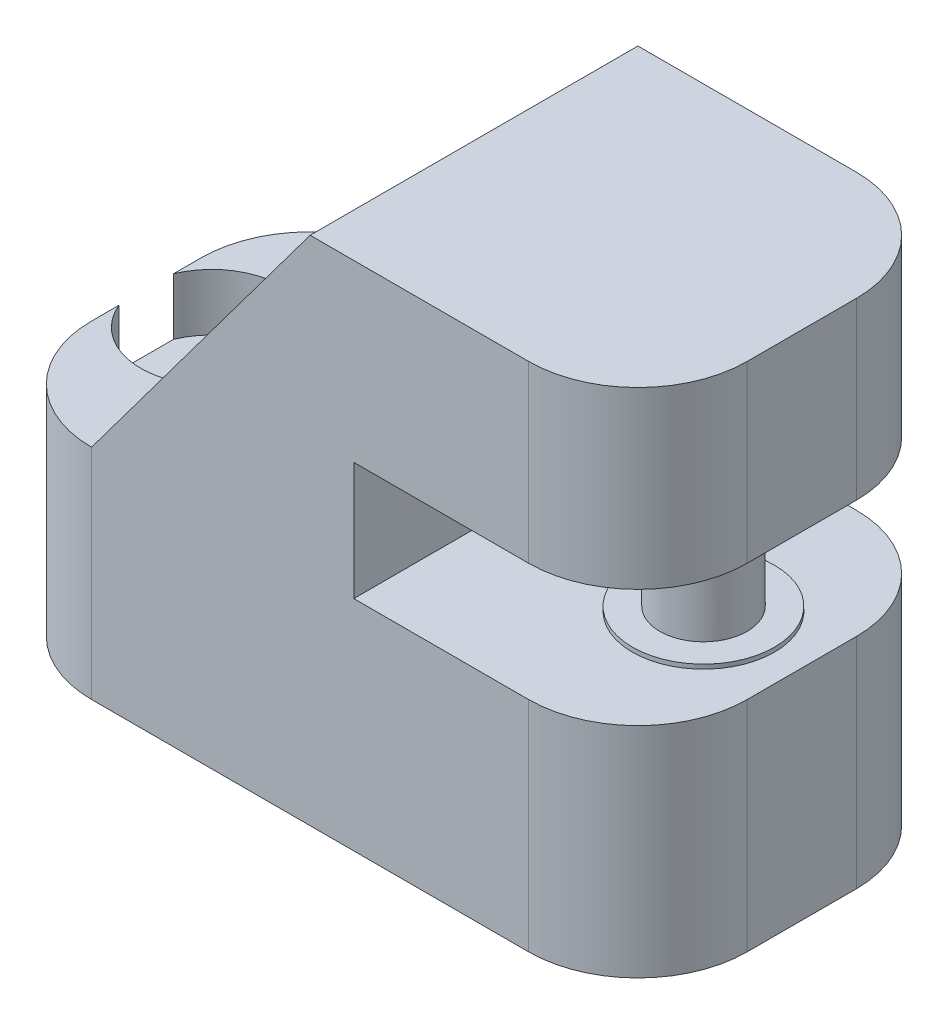
ISO-10303-21;
HEADER;
FILE_DESCRIPTION(('STEP AP214'),'2;1');
FILE_NAME('part.step','',(''),(''),'','','');
FILE_SCHEMA(('AUTOMOTIVE_DESIGN { 1 0 10303 214 1 1 1 1 }'));
ENDSEC;
DATA;
#1=APPLICATION_CONTEXT('core data for automotive mechanical design processes');
#2=APPLICATION_PROTOCOL_DEFINITION('international standard','automotive_design',2000,#1);
#3=PRODUCT_CONTEXT('',#1,'mechanical');
#4=PRODUCT('Part','Part','',(#3));
#5=PRODUCT_RELATED_PRODUCT_CATEGORY('part','',(#4));
#6=PRODUCT_DEFINITION_FORMATION('','',#4);
#7=PRODUCT_DEFINITION_CONTEXT('part definition',#1,'design');
#8=PRODUCT_DEFINITION('design','',#6,#7);
#9=PRODUCT_DEFINITION_SHAPE('','',#8);
#10=(LENGTH_UNIT() NAMED_UNIT(*) SI_UNIT(.MILLI.,.METRE.));
#11=(NAMED_UNIT(*) PLANE_ANGLE_UNIT() SI_UNIT($,.RADIAN.));
#12=(NAMED_UNIT(*) SI_UNIT($,.STERADIAN.) SOLID_ANGLE_UNIT());
#13=UNCERTAINTY_MEASURE_WITH_UNIT(LENGTH_MEASURE(1.E-05),#10,'distance_accuracy_value','');
#14=(GEOMETRIC_REPRESENTATION_CONTEXT(3) GLOBAL_UNCERTAINTY_ASSIGNED_CONTEXT((#13)) GLOBAL_UNIT_ASSIGNED_CONTEXT((#10,
#11,#12)) REPRESENTATION_CONTEXT('',''));
#15=CARTESIAN_POINT('',(0.,0.,0.));
#16=DIRECTION('',(0.,0.,1.));
#17=DIRECTION('',(1.,0.,0.));
#18=AXIS2_PLACEMENT_3D('',#15,#16,#17);
#19=CARTESIAN_POINT('',(0.,10.,-15.));
#20=DIRECTION('',(0.,-1.,0.));
#21=DIRECTION('',(0.,0.,1.));
#22=AXIS2_PLACEMENT_3D('',#19,#20,#21);
#23=PLANE('',#22);
#24=DIRECTION('',(0.,0.,1.));
#25=VECTOR('',#24,1.);
#26=CARTESIAN_POINT('',(5.,10.,-15.));
#27=LINE('',#26,#25);
#28=CARTESIAN_POINT('',(5.,10.,-15.));
#29=VERTEX_POINT('',#28);
#30=CARTESIAN_POINT('',(5.,10.,-10.0617376914899));
#31=VERTEX_POINT('',#30);
#32=EDGE_CURVE('E322',#29,#31,#27,.T.);
#33=ORIENTED_EDGE('',*,*,#32,.F.);
#34=CARTESIAN_POINT('',(5.,10.,-10.));
#35=DIRECTION('',(0.,1.,0.));
#36=DIRECTION('',(0.,0.,1.));
#37=AXIS2_PLACEMENT_3D('',#34,#35,#36);
#38=CIRCLE('',#37,5.);
#39=CARTESIAN_POINT('',(0.,10.,-10.));
#40=VERTEX_POINT('',#39);
#41=EDGE_CURVE('E244',#40,#29,#38,.F.);
#42=ORIENTED_EDGE('',*,*,#41,.F.);
#43=DIRECTION('',(0.,0.,1.));
#44=VECTOR('',#43,1.);
#45=CARTESIAN_POINT('',(0.,10.,-15.));
#46=LINE('',#45,#44);
#47=CARTESIAN_POINT('',(0.,10.,-8.74999999999999));
#48=VERTEX_POINT('',#47);
#49=EDGE_CURVE('E327',#40,#48,#46,.T.);
#50=ORIENTED_EDGE('',*,*,#49,.T.);
#51=CARTESIAN_POINT('',(3.,10.,-7.5));
#52=DIRECTION('',(0.,1.,0.));
#53=DIRECTION('',(0.,0.,1.));
#54=AXIS2_PLACEMENT_3D('',#51,#52,#53);
#55=CIRCLE('',#54,3.25);
#56=EDGE_CURVE('E405',#31,#48,#55,.T.);
#57=ORIENTED_EDGE('',*,*,#56,.F.);
#58=EDGE_LOOP('',(#33,#42,#50,#57));
#59=FACE_BOUND('',#58,.T.);
#60=ADVANCED_FACE('F47',(#59),#23,.F.);
#61=CARTESIAN_POINT('',(30.,0.,-15.));
#62=DIRECTION('',(0.,1.,0.));
#63=DIRECTION('',(-1.,0.,0.));
#64=AXIS2_PLACEMENT_3D('',#61,#62,#63);
#65=PLANE('',#64);
#66=CARTESIAN_POINT('',(3.,0.,-7.5));
#67=DIRECTION('',(0.,-1.,0.));
#68=DIRECTION('',(0.,0.,-1.));
#69=AXIS2_PLACEMENT_3D('',#66,#67,#68);
#70=CIRCLE('',#69,1.69999999999999);
#71=CARTESIAN_POINT('',(3.,0.,-9.19999999999999));
#72=VERTEX_POINT('',#71);
#73=EDGE_CURVE('E408',#72,#72,#70,.T.);
#74=ORIENTED_EDGE('',*,*,#73,.F.);
#75=EDGE_LOOP('',(#74));
#76=FACE_BOUND('',#75,.T.);
#77=CARTESIAN_POINT('',(10.,0.,-7.5));
#78=DIRECTION('',(0.,-1.,0.));
#79=DIRECTION('',(0.,0.,-1.));
#80=AXIS2_PLACEMENT_3D('',#77,#78,#79);
#81=CIRCLE('',#80,1.69999999999999);
#82=CARTESIAN_POINT('',(10.,0.,-9.19999999999999));
#83=VERTEX_POINT('',#82);
#84=EDGE_CURVE('E198',#83,#83,#81,.T.);
#85=ORIENTED_EDGE('',*,*,#84,.F.);
#86=EDGE_LOOP('',(#85));
#87=FACE_BOUND('',#86,.T.);
#88=DIRECTION('',(0.,0.,1.));
#89=VECTOR('',#88,1.);
#90=CARTESIAN_POINT('',(0.,0.,-15.));
#91=LINE('',#90,#89);
#92=CARTESIAN_POINT('',(0.,0.,-10.));
#93=VERTEX_POINT('',#92);
#94=CARTESIAN_POINT('',(0.,0.,-5.));
#95=VERTEX_POINT('',#94);
#96=EDGE_CURVE('E331',#93,#95,#91,.T.);
#97=ORIENTED_EDGE('',*,*,#96,.F.);
#98=CARTESIAN_POINT('',(5.,0.,-10.));
#99=DIRECTION('',(0.,-1.,0.));
#100=DIRECTION('',(-1.,0.,0.));
#101=AXIS2_PLACEMENT_3D('',#98,#99,#100);
#102=CIRCLE('',#101,5.);
#103=CARTESIAN_POINT('',(5.,0.,-15.));
#104=VERTEX_POINT('',#103);
#105=EDGE_CURVE('E261',#104,#93,#102,.F.);
#106=ORIENTED_EDGE('',*,*,#105,.F.);
#107=DIRECTION('',(1.,0.,0.));
#108=VECTOR('',#107,1.);
#109=CARTESIAN_POINT('',(30.,0.,-15.));
#110=LINE('',#109,#108);
#111=CARTESIAN_POINT('',(25.,0.,-15.));
#112=VERTEX_POINT('',#111);
#113=EDGE_CURVE('E340',#104,#112,#110,.T.);
#114=ORIENTED_EDGE('',*,*,#113,.T.);
#115=CARTESIAN_POINT('',(25.,0.,-10.));
#116=DIRECTION('',(0.,-1.,0.));
#117=DIRECTION('',(-1.,0.,0.));
#118=AXIS2_PLACEMENT_3D('',#115,#116,#117);
#119=CIRCLE('',#118,5.);
#120=CARTESIAN_POINT('',(30.,0.,-10.));
#121=VERTEX_POINT('',#120);
#122=EDGE_CURVE('E269',#121,#112,#119,.F.);
#123=ORIENTED_EDGE('',*,*,#122,.F.);
#124=DIRECTION('',(0.,0.,1.));
#125=VECTOR('',#124,1.);
#126=CARTESIAN_POINT('',(30.,0.,-15.));
#127=LINE('',#126,#125);
#128=CARTESIAN_POINT('',(30.,0.,-5.));
#129=VERTEX_POINT('',#128);
#130=EDGE_CURVE('E289',#121,#129,#127,.T.);
#131=ORIENTED_EDGE('',*,*,#130,.T.);
#132=CARTESIAN_POINT('',(25.,0.,-5.));
#133=DIRECTION('',(0.,-1.,0.));
#134=DIRECTION('',(-1.,0.,0.));
#135=AXIS2_PLACEMENT_3D('',#132,#133,#134);
#136=CIRCLE('',#135,5.);
#137=CARTESIAN_POINT('',(25.,0.,0.));
#138=VERTEX_POINT('',#137);
#139=EDGE_CURVE('E265',#138,#129,#136,.F.);
#140=ORIENTED_EDGE('',*,*,#139,.F.);
#141=DIRECTION('',(1.,0.,0.));
#142=VECTOR('',#141,1.);
#143=CARTESIAN_POINT('',(30.,0.,0.));
#144=LINE('',#143,#142);
#145=CARTESIAN_POINT('',(5.,0.,0.));
#146=VERTEX_POINT('',#145);
#147=EDGE_CURVE('E294',#146,#138,#144,.T.);
#148=ORIENTED_EDGE('',*,*,#147,.F.);
#149=CARTESIAN_POINT('',(5.,0.,-5.));
#150=DIRECTION('',(0.,-1.,0.));
#151=DIRECTION('',(-1.,0.,0.));
#152=AXIS2_PLACEMENT_3D('',#149,#150,#151);
#153=CIRCLE('',#152,5.);
#154=EDGE_CURVE('E257',#95,#146,#153,.F.);
#155=ORIENTED_EDGE('',*,*,#154,.F.);
#156=EDGE_LOOP('',(#97,#106,#114,#123,#131,#140,#148,#155));
#157=FACE_BOUND('',#156,.T.);
#158=ADVANCED_FACE('F428',(#76,#87,#157),#65,.F.);
#159=CARTESIAN_POINT('',(30.,10.,-15.));
#160=DIRECTION('',(-1.,0.,0.));
#161=DIRECTION('',(0.,0.,-1.));
#162=AXIS2_PLACEMENT_3D('',#159,#160,#161);
#163=PLANE('',#162);
#164=ORIENTED_EDGE('',*,*,#130,.F.);
#165=DIRECTION('',(0.,1.,0.));
#166=VECTOR('',#165,1.);
#167=CARTESIAN_POINT('',(30.,10.,-10.));
#168=LINE('',#167,#166);
#169=CARTESIAN_POINT('',(30.,10.,-10.));
#170=VERTEX_POINT('',#169);
#171=EDGE_CURVE('E206',#170,#121,#168,.F.);
#172=ORIENTED_EDGE('',*,*,#171,.F.);
#173=DIRECTION('',(0.,0.,1.));
#174=VECTOR('',#173,1.);
#175=CARTESIAN_POINT('',(30.,10.,-15.));
#176=LINE('',#175,#174);
#177=CARTESIAN_POINT('',(30.,10.,-5.));
#178=VERTEX_POINT('',#177);
#179=EDGE_CURVE('E298',#170,#178,#176,.T.);
#180=ORIENTED_EDGE('',*,*,#179,.T.);
#181=DIRECTION('',(0.,1.,0.));
#182=VECTOR('',#181,1.);
#183=CARTESIAN_POINT('',(30.,10.,-5.));
#184=LINE('',#183,#182);
#185=EDGE_CURVE('E204',#129,#178,#184,.T.);
#186=ORIENTED_EDGE('',*,*,#185,.F.);
#187=EDGE_LOOP('',(#164,#172,#180,#186));
#188=FACE_BOUND('',#187,.T.);
#189=ADVANCED_FACE('F435',(#188),#163,.F.);
#190=CARTESIAN_POINT('',(17.,10.,-15.));
#191=DIRECTION('',(0.,-1.,0.));
#192=DIRECTION('',(1.,0.,0.));
#193=AXIS2_PLACEMENT_3D('',#190,#191,#192);
#194=PLANE('',#193);
#195=CARTESIAN_POINT('',(25.5,10.,-7.5));
#196=DIRECTION('',(0.,1.,0.));
#197=DIRECTION('',(1.,0.,0.));
#198=AXIS2_PLACEMENT_3D('',#195,#196,#197);
#199=CIRCLE('',#198,3.25);
#200=CARTESIAN_POINT('',(28.75,10.,-7.5));
#201=VERTEX_POINT('',#200);
#202=EDGE_CURVE('E279',#201,#201,#199,.F.);
#203=ORIENTED_EDGE('',*,*,#202,.T.);
#204=EDGE_LOOP('',(#203));
#205=FACE_BOUND('',#204,.T.);
#206=ORIENTED_EDGE('',*,*,#179,.F.);
#207=CARTESIAN_POINT('',(25.,10.,-10.));
#208=DIRECTION('',(0.,1.,0.));
#209=DIRECTION('',(1.,0.,0.));
#210=AXIS2_PLACEMENT_3D('',#207,#208,#209);
#211=CIRCLE('',#210,5.);
#212=CARTESIAN_POINT('',(25.,10.,-15.));
#213=VERTEX_POINT('',#212);
#214=EDGE_CURVE('E201',#213,#170,#211,.F.);
#215=ORIENTED_EDGE('',*,*,#214,.F.);
#216=DIRECTION('',(-1.,0.,0.));
#217=VECTOR('',#216,1.);
#218=CARTESIAN_POINT('',(17.,10.,-15.));
#219=LINE('',#218,#217);
#220=CARTESIAN_POINT('',(17.,10.,-15.));
#221=VERTEX_POINT('',#220);
#222=EDGE_CURVE('E374',#213,#221,#219,.T.);
#223=ORIENTED_EDGE('',*,*,#222,.T.);
#224=DIRECTION('',(0.,0.,1.));
#225=VECTOR('',#224,1.);
#226=CARTESIAN_POINT('',(17.,10.,-15.));
#227=LINE('',#226,#225);
#228=CARTESIAN_POINT('',(17.,10.,0.));
#229=VERTEX_POINT('',#228);
#230=EDGE_CURVE('E302',#221,#229,#227,.T.);
#231=ORIENTED_EDGE('',*,*,#230,.T.);
#232=DIRECTION('',(-1.,0.,0.));
#233=VECTOR('',#232,1.);
#234=CARTESIAN_POINT('',(17.,10.,0.));
#235=LINE('',#234,#233);
#236=CARTESIAN_POINT('',(25.,10.,0.));
#237=VERTEX_POINT('',#236);
#238=EDGE_CURVE('E353',#237,#229,#235,.T.);
#239=ORIENTED_EDGE('',*,*,#238,.F.);
#240=CARTESIAN_POINT('',(25.,10.,-5.));
#241=DIRECTION('',(0.,1.,0.));
#242=DIRECTION('',(1.,0.,0.));
#243=AXIS2_PLACEMENT_3D('',#240,#241,#242);
#244=CIRCLE('',#243,5.);
#245=EDGE_CURVE('E70',#178,#237,#244,.F.);
#246=ORIENTED_EDGE('',*,*,#245,.F.);
#247=EDGE_LOOP('',(#206,#215,#223,#231,#239,#246));
#248=FACE_BOUND('',#247,.T.);
#249=ADVANCED_FACE('F492',(#205,#248),#194,.F.);
#250=CARTESIAN_POINT('',(17.,15.4,-15.));
#251=DIRECTION('',(-1.,0.,0.));
#252=DIRECTION('',(0.,0.,-1.));
#253=AXIS2_PLACEMENT_3D('',#250,#251,#252);
#254=PLANE('',#253);
#255=DIRECTION('',(0.,1.,0.));
#256=VECTOR('',#255,1.);
#257=CARTESIAN_POINT('',(17.,15.4,0.));
#258=LINE('',#257,#256);
#259=CARTESIAN_POINT('',(17.,15.4,0.));
#260=VERTEX_POINT('',#259);
#261=EDGE_CURVE('E349',#229,#260,#258,.T.);
#262=ORIENTED_EDGE('',*,*,#261,.F.);
#263=ORIENTED_EDGE('',*,*,#230,.F.);
#264=DIRECTION('',(0.,1.,0.));
#265=VECTOR('',#264,1.);
#266=CARTESIAN_POINT('',(17.,15.4,-15.));
#267=LINE('',#266,#265);
#268=CARTESIAN_POINT('',(17.,15.4,-15.));
#269=VERTEX_POINT('',#268);
#270=EDGE_CURVE('E370',#221,#269,#267,.T.);
#271=ORIENTED_EDGE('',*,*,#270,.T.);
#272=DIRECTION('',(0.,0.,1.));
#273=VECTOR('',#272,1.);
#274=CARTESIAN_POINT('',(17.,15.4,-15.));
#275=LINE('',#274,#273);
#276=EDGE_CURVE('E306',#269,#260,#275,.T.);
#277=ORIENTED_EDGE('',*,*,#276,.T.);
#278=EDGE_LOOP('',(#262,#263,#271,#277));
#279=FACE_BOUND('',#278,.T.);
#280=ADVANCED_FACE('F494',(#279),#254,.F.);
#281=CARTESIAN_POINT('',(30.,15.4,-15.));
#282=DIRECTION('',(0.,1.,0.));
#283=DIRECTION('',(-1.,0.,0.));
#284=AXIS2_PLACEMENT_3D('',#281,#282,#283);
#285=PLANE('',#284);
#286=CARTESIAN_POINT('',(25.5,15.4,-7.5));
#287=DIRECTION('',(0.,-1.,0.));
#288=DIRECTION('',(-1.,0.,0.));
#289=AXIS2_PLACEMENT_3D('',#286,#287,#288);
#290=CIRCLE('',#289,3.25);
#291=CARTESIAN_POINT('',(22.25,15.4,-7.5));
#292=VERTEX_POINT('',#291);
#293=EDGE_CURVE('E197',#292,#292,#290,.T.);
#294=ORIENTED_EDGE('',*,*,#293,.F.);
#295=EDGE_LOOP('',(#294));
#296=FACE_BOUND('',#295,.T.);
#297=DIRECTION('',(1.,0.,0.));
#298=VECTOR('',#297,1.);
#299=CARTESIAN_POINT('',(30.,15.4,0.));
#300=LINE('',#299,#298);
#301=CARTESIAN_POINT('',(25.,15.4,0.));
#302=VERTEX_POINT('',#301);
#303=EDGE_CURVE('E345',#260,#302,#300,.T.);
#304=ORIENTED_EDGE('',*,*,#303,.F.);
#305=ORIENTED_EDGE('',*,*,#276,.F.);
#306=DIRECTION('',(1.,0.,0.));
#307=VECTOR('',#306,1.);
#308=CARTESIAN_POINT('',(30.,15.4,-15.));
#309=LINE('',#308,#307);
#310=CARTESIAN_POINT('',(25.,15.4,-15.));
#311=VERTEX_POINT('',#310);
#312=EDGE_CURVE('E366',#269,#311,#309,.T.);
#313=ORIENTED_EDGE('',*,*,#312,.T.);
#314=CARTESIAN_POINT('',(25.,15.4,-10.));
#315=DIRECTION('',(0.,-1.,0.));
#316=DIRECTION('',(-1.,0.,0.));
#317=AXIS2_PLACEMENT_3D('',#314,#315,#316);
#318=CIRCLE('',#317,5.);
#319=CARTESIAN_POINT('',(30.,15.4,-10.));
#320=VERTEX_POINT('',#319);
#321=EDGE_CURVE('E213',#320,#311,#318,.F.);
#322=ORIENTED_EDGE('',*,*,#321,.F.);
#323=DIRECTION('',(0.,0.,1.));
#324=VECTOR('',#323,1.);
#325=CARTESIAN_POINT('',(30.,15.4,-15.));
#326=LINE('',#325,#324);
#327=CARTESIAN_POINT('',(30.,15.4,-5.));
#328=VERTEX_POINT('',#327);
#329=EDGE_CURVE('E310',#320,#328,#326,.T.);
#330=ORIENTED_EDGE('',*,*,#329,.T.);
#331=CARTESIAN_POINT('',(25.,15.4,-5.));
#332=DIRECTION('',(0.,-1.,0.));
#333=DIRECTION('',(-1.,0.,0.));
#334=AXIS2_PLACEMENT_3D('',#331,#332,#333);
#335=CIRCLE('',#334,5.);
#336=EDGE_CURVE('E209',#302,#328,#335,.F.);
#337=ORIENTED_EDGE('',*,*,#336,.F.);
#338=EDGE_LOOP('',(#304,#305,#313,#322,#330,#337));
#339=FACE_BOUND('',#338,.T.);
#340=ADVANCED_FACE('F497',(#296,#339),#285,.F.);
#341=CARTESIAN_POINT('',(30.,23.4,-15.));
#342=DIRECTION('',(-1.,0.,0.));
#343=DIRECTION('',(0.,-1.,0.));
#344=AXIS2_PLACEMENT_3D('',#341,#342,#343);
#345=PLANE('',#344);
#346=ORIENTED_EDGE('',*,*,#329,.F.);
#347=DIRECTION('',(0.,1.,0.));
#348=VECTOR('',#347,1.);
#349=CARTESIAN_POINT('',(30.,23.4,-10.));
#350=LINE('',#349,#348);
#351=CARTESIAN_POINT('',(30.,23.4,-10.));
#352=VERTEX_POINT('',#351);
#353=EDGE_CURVE('E228',#352,#320,#350,.F.);
#354=ORIENTED_EDGE('',*,*,#353,.F.);
#355=DIRECTION('',(0.,0.,1.));
#356=VECTOR('',#355,1.);
#357=CARTESIAN_POINT('',(30.,23.4,-15.));
#358=LINE('',#357,#356);
#359=CARTESIAN_POINT('',(30.,23.4,-5.));
#360=VERTEX_POINT('',#359);
#361=EDGE_CURVE('E314',#352,#360,#358,.T.);
#362=ORIENTED_EDGE('',*,*,#361,.T.);
#363=DIRECTION('',(0.,1.,0.));
#364=VECTOR('',#363,1.);
#365=CARTESIAN_POINT('',(30.,23.4,-5.));
#366=LINE('',#365,#364);
#367=EDGE_CURVE('E224',#328,#360,#366,.T.);
#368=ORIENTED_EDGE('',*,*,#367,.F.);
#369=EDGE_LOOP('',(#346,#354,#362,#368));
#370=FACE_BOUND('',#369,.T.);
#371=ADVANCED_FACE('F505',(#370),#345,.F.);
#372=CARTESIAN_POINT('',(15.,23.4,-15.));
#373=DIRECTION('',(0.,-1.,0.));
#374=DIRECTION('',(0.,0.,1.));
#375=AXIS2_PLACEMENT_3D('',#372,#373,#374);
#376=PLANE('',#375);
#377=ORIENTED_EDGE('',*,*,#361,.F.);
#378=CARTESIAN_POINT('',(25.,23.4,-10.));
#379=DIRECTION('',(0.,1.,0.));
#380=DIRECTION('',(0.,0.,1.));
#381=AXIS2_PLACEMENT_3D('',#378,#379,#380);
#382=CIRCLE('',#381,5.);
#383=CARTESIAN_POINT('',(25.,23.4,-15.));
#384=VERTEX_POINT('',#383);
#385=EDGE_CURVE('E221',#384,#352,#382,.F.);
#386=ORIENTED_EDGE('',*,*,#385,.F.);
#387=DIRECTION('',(-1.,0.,0.));
#388=VECTOR('',#387,1.);
#389=CARTESIAN_POINT('',(15.,23.4,-15.));
#390=LINE('',#389,#388);
#391=CARTESIAN_POINT('',(15.,23.4,-15.));
#392=VERTEX_POINT('',#391);
#393=EDGE_CURVE('E362',#384,#392,#390,.T.);
#394=ORIENTED_EDGE('',*,*,#393,.T.);
#395=DIRECTION('',(0.,0.,1.));
#396=VECTOR('',#395,1.);
#397=CARTESIAN_POINT('',(15.,23.4,-15.));
#398=LINE('',#397,#396);
#399=CARTESIAN_POINT('',(15.,23.4,0.));
#400=VERTEX_POINT('',#399);
#401=EDGE_CURVE('E318',#392,#400,#398,.T.);
#402=ORIENTED_EDGE('',*,*,#401,.T.);
#403=DIRECTION('',(-1.,0.,0.));
#404=VECTOR('',#403,1.);
#405=CARTESIAN_POINT('',(15.,23.4,0.));
#406=LINE('',#405,#404);
#407=CARTESIAN_POINT('',(25.,23.4,0.));
#408=VERTEX_POINT('',#407);
#409=EDGE_CURVE('E341',#408,#400,#406,.T.);
#410=ORIENTED_EDGE('',*,*,#409,.F.);
#411=CARTESIAN_POINT('',(25.,23.4,-5.));
#412=DIRECTION('',(0.,1.,0.));
#413=DIRECTION('',(0.,0.,1.));
#414=AXIS2_PLACEMENT_3D('',#411,#412,#413);
#415=CIRCLE('',#414,5.);
#416=EDGE_CURVE('E217',#360,#408,#415,.F.);
#417=ORIENTED_EDGE('',*,*,#416,.F.);
#418=EDGE_LOOP('',(#377,#386,#394,#402,#410,#417));
#419=FACE_BOUND('',#418,.T.);
#420=ADVANCED_FACE('F449',(#419),#376,.F.);
#421=CARTESIAN_POINT('',(5.,10.,-15.));
#422=DIRECTION('',(0.801433113275891,-0.598084412892456,0.));
#423=DIRECTION('',(0.598084412892456,0.801433113275891,0.));
#424=AXIS2_PLACEMENT_3D('',#421,#422,#423);
#425=PLANE('',#424);
#426=CARTESIAN_POINT('',(10.,16.7,-7.5));
#427=DIRECTION('',(-0.801433113275891,0.598084412892456,0.));
#428=DIRECTION('',(0.598084412892456,0.801433113275891,0.));
#429=AXIS2_PLACEMENT_3D('',#426,#427,#428);
#430=ELLIPSE('',#429,5.43401555021698,3.25);
#431=CARTESIAN_POINT('',(13.25,21.055,-7.5));
#432=VERTEX_POINT('',#431);
#433=EDGE_CURVE('E193',#432,#432,#430,.T.);
#434=ORIENTED_EDGE('',*,*,#433,.F.);
#435=EDGE_LOOP('',(#434));
#436=FACE_BOUND('',#435,.T.);
#437=CARTESIAN_POINT('',(5.,10.,-4.93826230851011));
#438=VERTEX_POINT('',#437);
#439=CARTESIAN_POINT('',(5.,10.,0.));
#440=VERTEX_POINT('',#439);
#441=EDGE_CURVE('E326',#438,#440,#27,.T.);
#442=ORIENTED_EDGE('',*,*,#441,.T.);
#443=DIRECTION('',(-0.598084412892456,-0.801433113275891,0.));
#444=VECTOR('',#443,1.);
#445=CARTESIAN_POINT('',(5.,10.,0.));
#446=LINE('',#445,#444);
#447=EDGE_CURVE('E336',#400,#440,#446,.T.);
#448=ORIENTED_EDGE('',*,*,#447,.F.);
#449=ORIENTED_EDGE('',*,*,#401,.F.);
#450=DIRECTION('',(-0.598084412892456,-0.801433113275891,0.));
#451=VECTOR('',#450,1.);
#452=CARTESIAN_POINT('',(5.,10.,-15.));
#453=LINE('',#452,#451);
#454=EDGE_CURVE('E335',#392,#29,#453,.T.);
#455=ORIENTED_EDGE('',*,*,#454,.T.);
#456=ORIENTED_EDGE('',*,*,#32,.T.);
#457=CARTESIAN_POINT('',(3.,7.32,-7.5));
#458=DIRECTION('',(-0.801433113275891,0.598084412892456,0.));
#459=DIRECTION('',(0.598084412892456,0.801433113275891,0.));
#460=AXIS2_PLACEMENT_3D('',#457,#458,#459);
#461=ELLIPSE('',#460,5.43401555021698,3.25);
#462=EDGE_CURVE('E402',#438,#31,#461,.T.);
#463=ORIENTED_EDGE('',*,*,#462,.F.);
#464=EDGE_LOOP('',(#442,#448,#449,#455,#456,#463));
#465=FACE_BOUND('',#464,.T.);
#466=ADVANCED_FACE('F442',(#436,#465),#425,.F.);
#467=CARTESIAN_POINT('',(0.,10.,-6.25000000000001));
#468=VERTEX_POINT('',#467);
#469=CARTESIAN_POINT('',(0.,10.,-5.));
#470=VERTEX_POINT('',#469);
#471=EDGE_CURVE('E185',#468,#470,#46,.T.);
#472=ORIENTED_EDGE('',*,*,#471,.T.);
#473=CARTESIAN_POINT('',(5.,10.,-5.));
#474=DIRECTION('',(0.,1.,0.));
#475=DIRECTION('',(0.,0.,1.));
#476=AXIS2_PLACEMENT_3D('',#473,#474,#475);
#477=CIRCLE('',#476,5.);
#478=EDGE_CURVE('E240',#440,#470,#477,.F.);
#479=ORIENTED_EDGE('',*,*,#478,.F.);
#480=ORIENTED_EDGE('',*,*,#441,.F.);
#481=EDGE_CURVE('E401',#468,#438,#55,.T.);
#482=ORIENTED_EDGE('',*,*,#481,.F.);
#483=EDGE_LOOP('',(#472,#479,#480,#482));
#484=FACE_BOUND('',#483,.T.);
#485=ADVANCED_FACE('F431',(#484),#23,.F.);
#486=CARTESIAN_POINT('',(0.,0.,-15.));
#487=DIRECTION('',(1.,0.,0.));
#488=DIRECTION('',(0.,0.,1.));
#489=AXIS2_PLACEMENT_3D('',#486,#487,#488);
#490=PLANE('',#489);
#491=DIRECTION('',(0.,0.,1.));
#492=VECTOR('',#491,1.);
#493=CARTESIAN_POINT('',(0.,7.4,-15.));
#494=LINE('',#493,#492);
#495=CARTESIAN_POINT('',(0.,7.4,-8.74999999999999));
#496=VERTEX_POINT('',#495);
#497=CARTESIAN_POINT('',(0.,7.4,-6.25000000000001));
#498=VERTEX_POINT('',#497);
#499=EDGE_CURVE('E56',#496,#498,#494,.T.);
#500=ORIENTED_EDGE('',*,*,#499,.F.);
#501=DIRECTION('',(0.,1.,0.));
#502=VECTOR('',#501,1.);
#503=CARTESIAN_POINT('',(0.,23.4,-8.74999999999999));
#504=LINE('',#503,#502);
#505=EDGE_CURVE('E176',#48,#496,#504,.F.);
#506=ORIENTED_EDGE('',*,*,#505,.F.);
#507=ORIENTED_EDGE('',*,*,#49,.F.);
#508=DIRECTION('',(0.,-1.,0.));
#509=VECTOR('',#508,1.);
#510=CARTESIAN_POINT('',(0.,0.,-10.));
#511=LINE('',#510,#509);
#512=EDGE_CURVE('E276',#93,#40,#511,.F.);
#513=ORIENTED_EDGE('',*,*,#512,.F.);
#514=ORIENTED_EDGE('',*,*,#96,.T.);
#515=DIRECTION('',(0.,-1.,0.));
#516=VECTOR('',#515,1.);
#517=CARTESIAN_POINT('',(0.,0.,-5.));
#518=LINE('',#517,#516);
#519=EDGE_CURVE('E273',#470,#95,#518,.T.);
#520=ORIENTED_EDGE('',*,*,#519,.F.);
#521=ORIENTED_EDGE('',*,*,#471,.F.);
#522=DIRECTION('',(0.,1.,0.));
#523=VECTOR('',#522,1.);
#524=CARTESIAN_POINT('',(0.,23.4,-6.25000000000001));
#525=LINE('',#524,#523);
#526=EDGE_CURVE('E11',#498,#468,#525,.T.);
#527=ORIENTED_EDGE('',*,*,#526,.F.);
#528=EDGE_LOOP('',(#500,#506,#507,#513,#514,#520,#521,#527));
#529=FACE_BOUND('',#528,.T.);
#530=ADVANCED_FACE('F183',(#529),#490,.F.);
#531=CARTESIAN_POINT('',(0.,0.,-15.));
#532=DIRECTION('',(0.,0.,1.));
#533=DIRECTION('',(-1.,0.,0.));
#534=AXIS2_PLACEMENT_3D('',#531,#532,#533);
#535=PLANE('',#534);
#536=ORIENTED_EDGE('',*,*,#454,.F.);
#537=ORIENTED_EDGE('',*,*,#393,.F.);
#538=DIRECTION('',(0.,1.,0.));
#539=VECTOR('',#538,1.);
#540=CARTESIAN_POINT('',(25.,0.,-15.));
#541=LINE('',#540,#539);
#542=EDGE_CURVE('E234',#311,#384,#541,.T.);
#543=ORIENTED_EDGE('',*,*,#542,.F.);
#544=ORIENTED_EDGE('',*,*,#312,.F.);
#545=ORIENTED_EDGE('',*,*,#270,.F.);
#546=ORIENTED_EDGE('',*,*,#222,.F.);
#547=DIRECTION('',(0.,1.,0.));
#548=VECTOR('',#547,1.);
#549=CARTESIAN_POINT('',(25.,0.,-15.));
#550=LINE('',#549,#548);
#551=EDGE_CURVE('E237',#112,#213,#550,.T.);
#552=ORIENTED_EDGE('',*,*,#551,.F.);
#553=ORIENTED_EDGE('',*,*,#113,.F.);
#554=DIRECTION('',(0.,-1.,0.));
#555=VECTOR('',#554,1.);
#556=CARTESIAN_POINT('',(5.,0.,-15.));
#557=LINE('',#556,#555);
#558=EDGE_CURVE('E231',#29,#104,#557,.T.);
#559=ORIENTED_EDGE('',*,*,#558,.F.);
#560=EDGE_LOOP('',(#536,#537,#543,#544,#545,#546,#552,#553,#559));
#561=FACE_BOUND('',#560,.T.);
#562=ADVANCED_FACE('F448',(#561),#535,.F.);
#563=CARTESIAN_POINT('',(0.,0.,0.));
#564=DIRECTION('',(0.,0.,1.));
#565=DIRECTION('',(-1.,0.,0.));
#566=AXIS2_PLACEMENT_3D('',#563,#564,#565);
#567=PLANE('',#566);
#568=ORIENTED_EDGE('',*,*,#147,.T.);
#569=DIRECTION('',(0.,1.,0.));
#570=VECTOR('',#569,1.);
#571=CARTESIAN_POINT('',(25.,0.,0.));
#572=LINE('',#571,#570);
#573=EDGE_CURVE('E254',#237,#138,#572,.F.);
#574=ORIENTED_EDGE('',*,*,#573,.F.);
#575=ORIENTED_EDGE('',*,*,#238,.T.);
#576=ORIENTED_EDGE('',*,*,#261,.T.);
#577=ORIENTED_EDGE('',*,*,#303,.T.);
#578=DIRECTION('',(0.,1.,0.));
#579=VECTOR('',#578,1.);
#580=CARTESIAN_POINT('',(25.,15.4,0.));
#581=LINE('',#580,#579);
#582=EDGE_CURVE('E251',#408,#302,#581,.F.);
#583=ORIENTED_EDGE('',*,*,#582,.F.);
#584=ORIENTED_EDGE('',*,*,#409,.T.);
#585=ORIENTED_EDGE('',*,*,#447,.T.);
#586=DIRECTION('',(0.,-1.,0.));
#587=VECTOR('',#586,1.);
#588=CARTESIAN_POINT('',(5.,10.,0.));
#589=LINE('',#588,#587);
#590=EDGE_CURVE('E248',#146,#440,#589,.F.);
#591=ORIENTED_EDGE('',*,*,#590,.F.);
#592=EDGE_LOOP('',(#568,#574,#575,#576,#577,#583,#584,#585,#591));
#593=FACE_BOUND('',#592,.T.);
#594=ADVANCED_FACE('F475',(#593),#567,.T.);
#595=CARTESIAN_POINT('',(25.5,23.402,-7.5));
#596=DIRECTION('',(0.,-1.,0.));
#597=DIRECTION('',(0.,0.,1.));
#598=AXIS2_PLACEMENT_3D('',#595,#596,#597);
#599=CYLINDRICAL_SURFACE('',#598,2.);
#600=CARTESIAN_POINT('',(25.5,15.2,-7.5));
#601=DIRECTION('',(0.,1.,0.));
#602=DIRECTION('',(1.,0.,0.));
#603=AXIS2_PLACEMENT_3D('',#600,#601,#602);
#604=CIRCLE('',#603,2.);
#605=CARTESIAN_POINT('',(27.5,15.2,-7.5));
#606=VERTEX_POINT('',#605);
#607=EDGE_CURVE('E280',#606,#606,#604,.T.);
#608=ORIENTED_EDGE('',*,*,#607,.F.);
#609=EDGE_LOOP('',(#608));
#610=FACE_BOUND('',#609,.T.);
#611=CARTESIAN_POINT('',(25.5,10.2,-7.5));
#612=DIRECTION('',(0.,-1.,0.));
#613=DIRECTION('',(-1.,0.,0.));
#614=AXIS2_PLACEMENT_3D('',#611,#612,#613);
#615=CIRCLE('',#614,2.);
#616=CARTESIAN_POINT('',(23.5,10.2,-7.5));
#617=VERTEX_POINT('',#616);
#618=EDGE_CURVE('E290',#617,#617,#615,.T.);
#619=ORIENTED_EDGE('',*,*,#618,.F.);
#620=EDGE_LOOP('',(#619));
#621=FACE_BOUND('',#620,.T.);
#622=ADVANCED_FACE('F578',(#610,#621),#599,.T.);
#623=CARTESIAN_POINT('',(25.5,10.2,-7.5));
#624=DIRECTION('',(0.,-1.,0.));
#625=DIRECTION('',(1.,0.,0.));
#626=AXIS2_PLACEMENT_3D('',#623,#624,#625);
#627=CYLINDRICAL_SURFACE('',#626,3.25);
#628=CARTESIAN_POINT('',(25.5,10.2,-7.5));
#629=DIRECTION('',(0.,-1.,0.));
#630=DIRECTION('',(-1.,0.,0.));
#631=AXIS2_PLACEMENT_3D('',#628,#629,#630);
#632=CIRCLE('',#631,3.25);
#633=CARTESIAN_POINT('',(22.25,10.2,-7.5));
#634=VERTEX_POINT('',#633);
#635=EDGE_CURVE('E284',#634,#634,#632,.T.);
#636=ORIENTED_EDGE('',*,*,#635,.T.);
#637=EDGE_LOOP('',(#636));
#638=FACE_BOUND('',#637,.T.);
#639=ORIENTED_EDGE('',*,*,#202,.F.);
#640=EDGE_LOOP('',(#639));
#641=FACE_BOUND('',#640,.T.);
#642=ADVANCED_FACE('F588',(#638,#641),#627,.T.);
#643=CARTESIAN_POINT('',(25.5,10.2,-7.5));
#644=DIRECTION('',(0.,1.,0.));
#645=DIRECTION('',(-1.,0.,0.));
#646=AXIS2_PLACEMENT_3D('',#643,#644,#645);
#647=PLANE('',#646);
#648=ORIENTED_EDGE('',*,*,#618,.T.);
#649=EDGE_LOOP('',(#648));
#650=FACE_BOUND('',#649,.T.);
#651=ORIENTED_EDGE('',*,*,#635,.F.);
#652=EDGE_LOOP('',(#651));
#653=FACE_BOUND('',#652,.T.);
#654=ADVANCED_FACE('F599',(#650,#653),#647,.T.);
#655=CARTESIAN_POINT('',(25.5,15.2,-7.5));
#656=DIRECTION('',(0.,1.,0.));
#657=DIRECTION('',(-1.,0.,0.));
#658=AXIS2_PLACEMENT_3D('',#655,#656,#657);
#659=CYLINDRICAL_SURFACE('',#658,3.25);
#660=CARTESIAN_POINT('',(25.5,15.2,-7.5));
#661=DIRECTION('',(0.,-1.,0.));
#662=DIRECTION('',(-1.,0.,0.));
#663=AXIS2_PLACEMENT_3D('',#660,#661,#662);
#664=CIRCLE('',#663,3.25);
#665=CARTESIAN_POINT('',(22.25,15.2,-7.5));
#666=VERTEX_POINT('',#665);
#667=EDGE_CURVE('E285',#666,#666,#664,.T.);
#668=ORIENTED_EDGE('',*,*,#667,.F.);
#669=EDGE_LOOP('',(#668));
#670=FACE_BOUND('',#669,.T.);
#671=ORIENTED_EDGE('',*,*,#293,.T.);
#672=EDGE_LOOP('',(#671));
#673=FACE_BOUND('',#672,.T.);
#674=ADVANCED_FACE('F610',(#670,#673),#659,.T.);
#675=CARTESIAN_POINT('',(25.5,15.2,-7.5));
#676=DIRECTION('',(0.,-1.,0.));
#677=DIRECTION('',(-1.,0.,0.));
#678=AXIS2_PLACEMENT_3D('',#675,#676,#677);
#679=PLANE('',#678);
#680=ORIENTED_EDGE('',*,*,#607,.T.);
#681=EDGE_LOOP('',(#680));
#682=FACE_BOUND('',#681,.T.);
#683=ORIENTED_EDGE('',*,*,#667,.T.);
#684=EDGE_LOOP('',(#683));
#685=FACE_BOUND('',#684,.T.);
#686=ADVANCED_FACE('F519',(#682,#685),#679,.T.);
#687=CARTESIAN_POINT('',(5.,0.,-5.));
#688=DIRECTION('',(0.,1.,0.));
#689=DIRECTION('',(0.,0.,-1.));
#690=AXIS2_PLACEMENT_3D('',#687,#688,#689);
#691=CYLINDRICAL_SURFACE('',#690,5.);
#692=ORIENTED_EDGE('',*,*,#478,.T.);
#693=ORIENTED_EDGE('',*,*,#519,.T.);
#694=ORIENTED_EDGE('',*,*,#154,.T.);
#695=ORIENTED_EDGE('',*,*,#590,.T.);
#696=EDGE_LOOP('',(#692,#693,#694,#695));
#697=FACE_BOUND('',#696,.T.);
#698=ADVANCED_FACE('F473',(#697),#691,.T.);
#699=CARTESIAN_POINT('',(5.,0.,-10.));
#700=DIRECTION('',(0.,-1.,0.));
#701=DIRECTION('',(0.,0.,1.));
#702=AXIS2_PLACEMENT_3D('',#699,#700,#701);
#703=CYLINDRICAL_SURFACE('',#702,5.);
#704=ORIENTED_EDGE('',*,*,#41,.T.);
#705=ORIENTED_EDGE('',*,*,#558,.T.);
#706=ORIENTED_EDGE('',*,*,#105,.T.);
#707=ORIENTED_EDGE('',*,*,#512,.T.);
#708=EDGE_LOOP('',(#704,#705,#706,#707));
#709=FACE_BOUND('',#708,.T.);
#710=ADVANCED_FACE('F466',(#709),#703,.T.);
#711=CARTESIAN_POINT('',(25.,23.4,-5.));
#712=DIRECTION('',(0.,-1.,0.));
#713=DIRECTION('',(1.,0.,0.));
#714=AXIS2_PLACEMENT_3D('',#711,#712,#713);
#715=CYLINDRICAL_SURFACE('',#714,5.);
#716=ORIENTED_EDGE('',*,*,#336,.T.);
#717=ORIENTED_EDGE('',*,*,#367,.T.);
#718=ORIENTED_EDGE('',*,*,#416,.T.);
#719=ORIENTED_EDGE('',*,*,#582,.T.);
#720=EDGE_LOOP('',(#716,#717,#718,#719));
#721=FACE_BOUND('',#720,.T.);
#722=ADVANCED_FACE('F501',(#721),#715,.T.);
#723=CARTESIAN_POINT('',(25.,0.,-10.));
#724=DIRECTION('',(0.,1.,0.));
#725=DIRECTION('',(-1.,0.,0.));
#726=AXIS2_PLACEMENT_3D('',#723,#724,#725);
#727=CYLINDRICAL_SURFACE('',#726,5.);
#728=ORIENTED_EDGE('',*,*,#321,.T.);
#729=ORIENTED_EDGE('',*,*,#542,.T.);
#730=ORIENTED_EDGE('',*,*,#385,.T.);
#731=ORIENTED_EDGE('',*,*,#353,.T.);
#732=EDGE_LOOP('',(#728,#729,#730,#731));
#733=FACE_BOUND('',#732,.T.);
#734=ADVANCED_FACE('F507',(#733),#727,.T.);
#735=CARTESIAN_POINT('',(25.,10.,-5.));
#736=DIRECTION('',(0.,-1.,0.));
#737=DIRECTION('',(0.,0.,1.));
#738=AXIS2_PLACEMENT_3D('',#735,#736,#737);
#739=CYLINDRICAL_SURFACE('',#738,5.);
#740=ORIENTED_EDGE('',*,*,#139,.T.);
#741=ORIENTED_EDGE('',*,*,#185,.T.);
#742=ORIENTED_EDGE('',*,*,#245,.T.);
#743=ORIENTED_EDGE('',*,*,#573,.T.);
#744=EDGE_LOOP('',(#740,#741,#742,#743));
#745=FACE_BOUND('',#744,.T.);
#746=ADVANCED_FACE('F490',(#745),#739,.T.);
#747=CARTESIAN_POINT('',(25.,0.,-10.));
#748=DIRECTION('',(0.,1.,0.));
#749=DIRECTION('',(0.,0.,-1.));
#750=AXIS2_PLACEMENT_3D('',#747,#748,#749);
#751=CYLINDRICAL_SURFACE('',#750,5.);
#752=ORIENTED_EDGE('',*,*,#122,.T.);
#753=ORIENTED_EDGE('',*,*,#551,.T.);
#754=ORIENTED_EDGE('',*,*,#214,.T.);
#755=ORIENTED_EDGE('',*,*,#171,.T.);
#756=EDGE_LOOP('',(#752,#753,#754,#755));
#757=FACE_BOUND('',#756,.T.);
#758=ADVANCED_FACE('F49',(#757),#751,.T.);
#759=CARTESIAN_POINT('',(10.,23.4,-7.5));
#760=DIRECTION('',(0.,1.,0.));
#761=DIRECTION('',(0.,0.,-1.));
#762=AXIS2_PLACEMENT_3D('',#759,#760,#761);
#763=CYLINDRICAL_SURFACE('',#762,3.25);
#764=CARTESIAN_POINT('',(10.,7.4,-7.5));
#765=DIRECTION('',(0.,-1.,0.));
#766=DIRECTION('',(0.,0.,-1.));
#767=AXIS2_PLACEMENT_3D('',#764,#765,#766);
#768=CIRCLE('',#767,3.25);
#769=CARTESIAN_POINT('',(10.,7.4,-10.75));
#770=VERTEX_POINT('',#769);
#771=EDGE_CURVE('E397',#770,#770,#768,.T.);
#772=ORIENTED_EDGE('',*,*,#771,.T.);
#773=EDGE_LOOP('',(#772));
#774=FACE_BOUND('',#773,.T.);
#775=ORIENTED_EDGE('',*,*,#433,.T.);
#776=EDGE_LOOP('',(#775));
#777=FACE_BOUND('',#776,.T.);
#778=ADVANCED_FACE('F676',(#774,#777),#763,.F.);
#779=CARTESIAN_POINT('',(10.,23.4,-7.5));
#780=DIRECTION('',(0.,1.,0.));
#781=DIRECTION('',(0.,0.,-1.));
#782=AXIS2_PLACEMENT_3D('',#779,#780,#781);
#783=CYLINDRICAL_SURFACE('',#782,1.7);
#784=ORIENTED_EDGE('',*,*,#84,.T.);
#785=EDGE_LOOP('',(#784));
#786=FACE_BOUND('',#785,.T.);
#787=CARTESIAN_POINT('',(10.,7.4,-7.5));
#788=DIRECTION('',(0.,-1.,0.));
#789=DIRECTION('',(0.,0.,-1.));
#790=AXIS2_PLACEMENT_3D('',#787,#788,#789);
#791=CIRCLE('',#790,1.7);
#792=CARTESIAN_POINT('',(10.,7.4,-9.2));
#793=VERTEX_POINT('',#792);
#794=EDGE_CURVE('E393',#793,#793,#791,.T.);
#795=ORIENTED_EDGE('',*,*,#794,.F.);
#796=EDGE_LOOP('',(#795));
#797=FACE_BOUND('',#796,.T.);
#798=ADVANCED_FACE('F685',(#786,#797),#783,.F.);
#799=CARTESIAN_POINT('',(13.25,7.4,-7.5));
#800=DIRECTION('',(0.,-1.,0.));
#801=DIRECTION('',(0.,0.,1.));
#802=AXIS2_PLACEMENT_3D('',#799,#800,#801);
#803=PLANE('',#802);
#804=ORIENTED_EDGE('',*,*,#794,.T.);
#805=EDGE_LOOP('',(#804));
#806=FACE_BOUND('',#805,.T.);
#807=ORIENTED_EDGE('',*,*,#771,.F.);
#808=EDGE_LOOP('',(#807));
#809=FACE_BOUND('',#808,.T.);
#810=ADVANCED_FACE('F694',(#806,#809),#803,.F.);
#811=CARTESIAN_POINT('',(6.25,7.4,-7.5));
#812=DIRECTION('',(0.,-1.,0.));
#813=DIRECTION('',(0.,0.,1.));
#814=AXIS2_PLACEMENT_3D('',#811,#812,#813);
#815=PLANE('',#814);
#816=CARTESIAN_POINT('',(3.,7.4,-7.5));
#817=DIRECTION('',(0.,-1.,0.));
#818=DIRECTION('',(0.,0.,-1.));
#819=AXIS2_PLACEMENT_3D('',#816,#817,#818);
#820=CIRCLE('',#819,1.7);
#821=CARTESIAN_POINT('',(3.,7.4,-9.2));
#822=VERTEX_POINT('',#821);
#823=EDGE_CURVE('E179',#822,#822,#820,.T.);
#824=ORIENTED_EDGE('',*,*,#823,.T.);
#825=EDGE_LOOP('',(#824));
#826=FACE_BOUND('',#825,.T.);
#827=CARTESIAN_POINT('',(3.,7.4,-7.5));
#828=DIRECTION('',(0.,-1.,0.));
#829=DIRECTION('',(0.,0.,-1.));
#830=AXIS2_PLACEMENT_3D('',#827,#828,#829);
#831=CIRCLE('',#830,3.25);
#832=EDGE_CURVE('E62',#496,#498,#831,.T.);
#833=ORIENTED_EDGE('',*,*,#832,.F.);
#834=ORIENTED_EDGE('',*,*,#499,.T.);
#835=EDGE_LOOP('',(#833,#834));
#836=FACE_BOUND('',#835,.T.);
#837=ADVANCED_FACE('F186',(#826,#836),#815,.F.);
#838=CARTESIAN_POINT('',(3.,23.4,-7.5));
#839=DIRECTION('',(0.,1.,0.));
#840=DIRECTION('',(0.,0.,-1.));
#841=AXIS2_PLACEMENT_3D('',#838,#839,#840);
#842=CYLINDRICAL_SURFACE('',#841,3.25);
#843=ORIENTED_EDGE('',*,*,#832,.T.);
#844=ORIENTED_EDGE('',*,*,#526,.T.);
#845=ORIENTED_EDGE('',*,*,#481,.T.);
#846=ORIENTED_EDGE('',*,*,#462,.T.);
#847=ORIENTED_EDGE('',*,*,#56,.T.);
#848=ORIENTED_EDGE('',*,*,#505,.T.);
#849=EDGE_LOOP('',(#843,#844,#845,#846,#847,#848));
#850=FACE_BOUND('',#849,.T.);
#851=ADVANCED_FACE('F173',(#850),#842,.F.);
#852=CARTESIAN_POINT('',(3.,23.4,-7.5));
#853=DIRECTION('',(0.,1.,0.));
#854=DIRECTION('',(0.,0.,-1.));
#855=AXIS2_PLACEMENT_3D('',#852,#853,#854);
#856=CYLINDRICAL_SURFACE('',#855,1.7);
#857=ORIENTED_EDGE('',*,*,#73,.T.);
#858=EDGE_LOOP('',(#857));
#859=FACE_BOUND('',#858,.T.);
#860=ORIENTED_EDGE('',*,*,#823,.F.);
#861=EDGE_LOOP('',(#860));
#862=FACE_BOUND('',#861,.T.);
#863=ADVANCED_FACE('F417',(#859,#862),#856,.F.);
#864=CLOSED_SHELL('',(#60,#158,#189,#249,#280,#340,#371,#420,#466,#485,#530,#562,#594,#622,#642,
#654,#674,#686,#698,#710,#722,#734,#746,#758,#778,#798,#810,#837,#851,#863));
#865=MANIFOLD_SOLID_BREP('B2',#864);
#866=ADVANCED_BREP_SHAPE_REPRESENTATION('',(#18,#865),#14);
#867=SHAPE_DEFINITION_REPRESENTATION(#9,#866);
ENDSEC;
END-ISO-10303-21;
